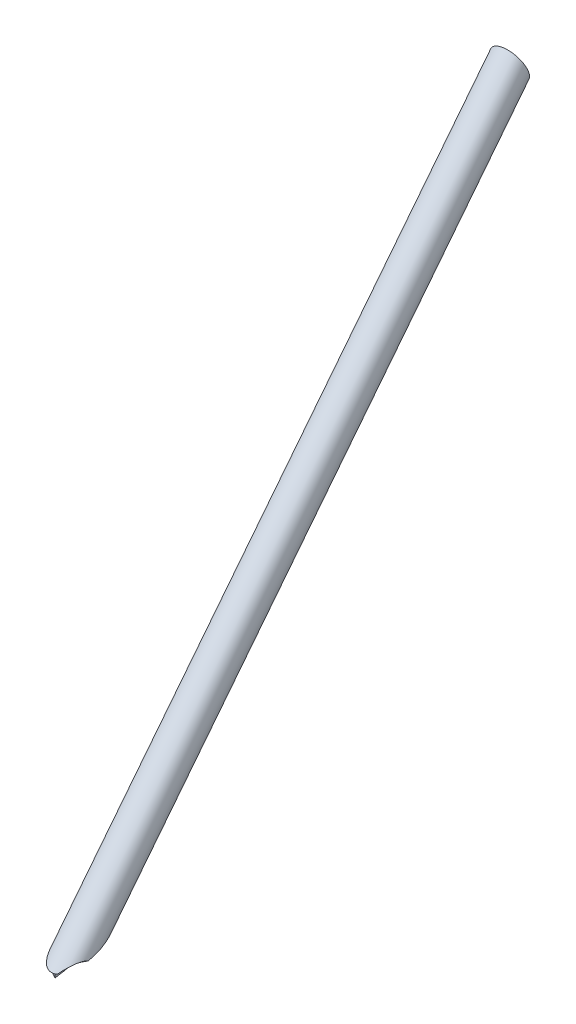
ISO-10303-21;
HEADER;
FILE_DESCRIPTION(('STEP AP214'),'2;1');
FILE_NAME('part.step','',(''),(''),'','','');
FILE_SCHEMA(('AUTOMOTIVE_DESIGN { 1 0 10303 214 1 1 1 1 }'));
ENDSEC;
DATA;
#1=APPLICATION_CONTEXT('core data for automotive mechanical design processes');
#2=APPLICATION_PROTOCOL_DEFINITION('international standard','automotive_design',2000,#1);
#3=PRODUCT_CONTEXT('',#1,'mechanical');
#4=PRODUCT('Part','Part','',(#3));
#5=PRODUCT_RELATED_PRODUCT_CATEGORY('part','',(#4));
#6=PRODUCT_DEFINITION_FORMATION('','',#4);
#7=PRODUCT_DEFINITION_CONTEXT('part definition',#1,'design');
#8=PRODUCT_DEFINITION('design','',#6,#7);
#9=PRODUCT_DEFINITION_SHAPE('','',#8);
#10=(LENGTH_UNIT() NAMED_UNIT(*) SI_UNIT(.MILLI.,.METRE.));
#11=(NAMED_UNIT(*) PLANE_ANGLE_UNIT() SI_UNIT($,.RADIAN.));
#12=(NAMED_UNIT(*) SI_UNIT($,.STERADIAN.) SOLID_ANGLE_UNIT());
#13=UNCERTAINTY_MEASURE_WITH_UNIT(LENGTH_MEASURE(1.E-05),#10,'distance_accuracy_value','');
#14=(GEOMETRIC_REPRESENTATION_CONTEXT(3) GLOBAL_UNCERTAINTY_ASSIGNED_CONTEXT((#13)) GLOBAL_UNIT_ASSIGNED_CONTEXT((#10,
#11,#12)) REPRESENTATION_CONTEXT('',''));
#15=CARTESIAN_POINT('',(0.,0.,0.));
#16=DIRECTION('',(0.,0.,1.));
#17=DIRECTION('',(1.,0.,0.));
#18=AXIS2_PLACEMENT_3D('',#15,#16,#17);
#19=CARTESIAN_POINT('',(79.9999999999999,380.,-601.037933611912));
#20=DIRECTION('',(0.313257210262409,-0.388871019636094,0.866400167535647));
#21=DIRECTION('',(0.,-0.912318699307092,-0.409480879766828));
#22=AXIS2_PLACEMENT_3D('',#19,#20,#21);
#23=CYLINDRICAL_SURFACE('',#22,7.9);
#24=CARTESIAN_POINT('',(222.917953673779,195.377291508024,-208.993378649136));
#25=CARTESIAN_POINT('',(223.012888083571,195.433726930084,-209.119116882952));
#26=CARTESIAN_POINT('',(223.104138431984,195.494269848754,-209.245777184897));
#27=CARTESIAN_POINT('',(223.280105681698,195.622380933648,-209.500115327002));
#28=CARTESIAN_POINT('',(223.364820289401,195.689951546757,-209.627793507182));
#29=CARTESIAN_POINT('',(223.528634818153,195.831254385907,-209.883653952705));
#30=CARTESIAN_POINT('',(223.607725975371,195.904995855745,-210.011836689933));
#31=CARTESIAN_POINT('',(223.76092313275,196.05782740779,-210.268006511559));
#32=CARTESIAN_POINT('',(223.835028227753,196.136918455949,-210.395993556333));
#33=CARTESIAN_POINT('',(224.052309585371,196.382926969586,-210.781500524532));
#34=CARTESIAN_POINT('',(224.188892439851,196.557188455598,-211.038071091826));
#35=CARTESIAN_POINT('',(224.448919782311,196.921959419964,-211.545800007279));
#36=CARTESIAN_POINT('',(224.57237338362,197.112457460483,-211.796962011791));
#37=CARTESIAN_POINT('',(224.776942315472,197.454170356936,-212.224321036627));
#38=CARTESIAN_POINT('',(224.860398831385,197.601869886103,-212.402224269208));
#39=CARTESIAN_POINT('',(225.022962726354,197.904873781393,-212.753515374758));
#40=CARTESIAN_POINT('',(225.102069764739,198.060178741409,-212.926902893478));
#41=CARTESIAN_POINT('',(225.256678731087,198.37843097543,-213.268551379092));
#42=CARTESIAN_POINT('',(225.33217691551,198.541385851937,-213.436806959755));
#43=CARTESIAN_POINT('',(225.479981924259,198.874812249495,-213.767151978885));
#44=CARTESIAN_POINT('',(225.552288904873,199.04528340162,-213.929241719269));
#45=CARTESIAN_POINT('',(225.693490547132,199.392433386815,-214.244967966279));
#46=CARTESIAN_POINT('',(225.762408546937,199.569048964059,-214.398663460934));
#47=CARTESIAN_POINT('',(225.897711302473,199.93003633822,-214.697916975523));
#48=CARTESIAN_POINT('',(225.964095766926,200.114409021873,-214.84347406068));
#49=CARTESIAN_POINT('',(226.09434524523,200.490856212501,-215.124827940735));
#50=CARTESIAN_POINT('',(226.158213993559,200.682918378672,-215.260639469395));
#51=CARTESIAN_POINT('',(226.283530904535,201.075232073557,-215.521007538282));
#52=CARTESIAN_POINT('',(226.344979958602,201.27548052995,-215.645568245636));
#53=CARTESIAN_POINT('',(226.447392881952,201.623434466193,-215.846156403963));
#54=CARTESIAN_POINT('',(226.489000040282,201.768996786018,-215.925578307174));
#55=CARTESIAN_POINT('',(226.570879988234,202.064336964657,-216.076936352935));
#56=CARTESIAN_POINT('',(226.611152863824,202.21411455073,-216.148872978398));
#57=CARTESIAN_POINT('',(226.690286353838,202.51808466004,-216.284297909734));
#58=CARTESIAN_POINT('',(226.729144961922,202.672282939986,-216.347774529356));
#59=CARTESIAN_POINT('',(226.805203274731,202.984791359438,-216.464918322809));
#60=CARTESIAN_POINT('',(226.842402945545,203.143101582897,-216.518585296182));
#61=CARTESIAN_POINT('',(226.915318707242,203.465472644866,-216.615237316068));
#62=CARTESIAN_POINT('',(226.951011861693,203.629579509086,-216.658087577271));
#63=CARTESIAN_POINT('',(227.020095881777,203.961225532968,-216.730573180454));
#64=CARTESIAN_POINT('',(227.053486514953,204.128765036973,-216.7602071898));
#65=CARTESIAN_POINT('',(227.117453561461,204.465988042297,-216.804360539596));
#66=CARTESIAN_POINT('',(227.148036352898,204.635665636074,-216.818914949004));
#67=CARTESIAN_POINT('',(227.205953992873,204.97617559598,-216.831164635051));
#68=CARTESIAN_POINT('',(227.233290498168,205.147007325631,-216.828868549318));
#69=CARTESIAN_POINT('',(227.27660869455,205.437357188732,-216.809230315878));
#70=CARTESIAN_POINT('',(227.293552559481,205.557058073156,-216.796555616039));
#71=CARTESIAN_POINT('',(227.325367727987,205.79532950089,-216.761653431045));
#72=CARTESIAN_POINT('',(227.340239534495,205.913900311961,-216.73942826936));
#73=CARTESIAN_POINT('',(227.36772712879,206.1489753004,-216.685192411289));
#74=CARTESIAN_POINT('',(227.38034435484,206.265480752278,-216.653187988955));
#75=CARTESIAN_POINT('',(227.403191134436,206.495590795566,-216.579366525467));
#76=CARTESIAN_POINT('',(227.413420617519,206.609195301279,-216.5375491948));
#77=CARTESIAN_POINT('',(227.431404675484,206.83273599438,-216.44427565963));
#78=CARTESIAN_POINT('',(227.439156342965,206.942667737856,-216.392808243456));
#79=CARTESIAN_POINT('',(227.45212980558,207.157958152705,-216.280717691105));
#80=CARTESIAN_POINT('',(227.457350720433,207.263315221268,-216.22009137876));
#81=CARTESIAN_POINT('',(227.465277056628,207.4688063395,-216.090339044893));
#82=CARTESIAN_POINT('',(227.467981496067,207.568938336028,-216.021209717486));
#83=CARTESIAN_POINT('',(227.47094093104,207.763484956176,-215.875268256289));
#84=CARTESIAN_POINT('',(227.47119539067,207.857898324429,-215.798454445325));
#85=CARTESIAN_POINT('',(227.469129930289,208.063698052783,-215.617846764081));
#86=CARTESIAN_POINT('',(227.466147125814,208.17338879079,-215.512123181927));
#87=CARTESIAN_POINT('',(227.456780942832,208.383190077019,-215.291735007128));
#88=CARTESIAN_POINT('',(227.450396486557,208.483297577053,-215.177067590581));
#89=CARTESIAN_POINT('',(227.426556723743,208.769705265191,-214.82174132444));
#90=CARTESIAN_POINT('',(227.404417576351,208.941919936901,-214.569913228727));
#91=CARTESIAN_POINT('',(227.356234764604,209.216028962779,-214.107933438384));
#92=CARTESIAN_POINT('',(227.332272238128,209.324979180343,-213.901580818846));
#93=CARTESIAN_POINT('',(227.279095846365,209.524792600736,-213.480815802341));
#94=CARTESIAN_POINT('',(227.249879002337,209.615645482055,-213.266398888436));
#95=CARTESIAN_POINT('',(227.186772988359,209.781289980862,-212.831758977117));
#96=CARTESIAN_POINT('',(227.152875525741,209.85605247573,-212.611526248664));
#97=CARTESIAN_POINT('',(227.080876774895,209.991170373415,-212.167307852279));
#98=CARTESIAN_POINT('',(227.042773938359,210.051520443912,-211.943320828028));
#99=CARTESIAN_POINT('',(226.967170071168,210.153281906896,-211.51831938256));
#100=CARTESIAN_POINT('',(226.930083203064,210.196059843875,-211.317554095141));
#101=CARTESIAN_POINT('',(226.85293914097,210.272416541946,-210.914835503661));
#102=CARTESIAN_POINT('',(226.812881475298,210.305993838234,-210.712882015653));
#103=CARTESIAN_POINT('',(226.68827982986,210.394200770023,-210.105851263459));
#104=CARTESIAN_POINT('',(226.599343421633,210.436258600358,-209.699807799988));
#105=CARTESIAN_POINT('',(226.409137660249,210.492057891408,-208.888068066644));
#106=CARTESIAN_POINT('',(226.307846584326,210.505748692749,-208.482373709036));
#107=CARTESIAN_POINT('',(226.091354588214,210.508417497333,-207.674828554905));
#108=CARTESIAN_POINT('',(225.976160610319,210.497407786651,-207.27297594734));
#109=CARTESIAN_POINT('',(225.763795783198,210.459623860328,-206.589380363559));
#110=CARTESIAN_POINT('',(225.67083158185,210.438230593355,-206.306016005625));
#111=CARTESIAN_POINT('',(225.474155076724,210.384826129073,-205.743942110612));
#112=CARTESIAN_POINT('',(225.370440492558,210.352812675813,-205.465233575753));
#113=CARTESIAN_POINT('',(225.149939011165,210.278697870624,-204.915178227719));
#114=CARTESIAN_POINT('',(225.033185126912,210.236621700209,-204.643814891119));
#115=CARTESIAN_POINT('',(224.782856186306,210.142507957935,-204.110762193817));
#116=CARTESIAN_POINT('',(224.64929217133,210.090476913159,-203.849066627678));
#117=CARTESIAN_POINT('',(224.424528459865,210.001528868784,-203.452660568412));
#118=CARTESIAN_POINT('',(224.340714883951,209.968103612592,-203.312972759542));
#119=CARTESIAN_POINT('',(224.16550257525,209.898009301119,-203.039301887405));
#120=CARTESIAN_POINT('',(224.07410623106,209.861341267085,-202.905317047656));
#121=CARTESIAN_POINT('',(223.882978374415,209.784689112119,-202.644700624613));
#122=CARTESIAN_POINT('',(223.783259196538,209.744709899061,-202.518058615116));
#123=CARTESIAN_POINT('',(223.574674929642,209.661237798938,-202.273755976076));
#124=CARTESIAN_POINT('',(223.465811873719,209.617745693031,-202.156093361056));
#125=CARTESIAN_POINT('',(223.257198986513,209.534480814693,-201.950119399441));
#126=CARTESIAN_POINT('',(223.158864877578,209.495260820413,-201.860152986442));
#127=CARTESIAN_POINT('',(222.955755076029,209.41413902135,-201.689159176252));
#128=CARTESIAN_POINT('',(222.850980978708,209.372237880628,-201.60812957905));
#129=CARTESIAN_POINT('',(222.63558099683,209.28567993122,-201.456108997409));
#130=CARTESIAN_POINT('',(222.524959774306,209.241025313342,-201.385110176307));
#131=CARTESIAN_POINT('',(222.298673344678,209.148832520759,-201.253819301503));
#132=CARTESIAN_POINT('',(222.183008023939,209.10129428108,-201.193527489166));
#133=CARTESIAN_POINT('',(221.947946209617,209.003301821729,-201.08404474988));
#134=CARTESIAN_POINT('',(221.828554782513,208.952851488607,-201.034839438096));
#135=CARTESIAN_POINT('',(221.587170362088,208.848873809021,-200.947303863317));
#136=CARTESIAN_POINT('',(221.465177335506,208.795346423199,-200.908973739456));
#137=CARTESIAN_POINT('',(221.219635699899,208.6850060593,-200.84263902345));
#138=CARTESIAN_POINT('',(221.09608483156,208.628187738916,-200.814651797489));
#139=CARTESIAN_POINT('',(220.848740169297,208.511212165082,-200.768343470395));
#140=CARTESIAN_POINT('',(220.72494631865,208.451054011646,-200.750024988817));
#141=CARTESIAN_POINT('',(220.427388225815,208.301836143795,-200.716481000202));
#142=CARTESIAN_POINT('',(220.253987472562,208.211055871608,-200.705617554726));
#143=CARTESIAN_POINT('',(219.910873942063,208.022246686899,-200.698951509076));
#144=CARTESIAN_POINT('',(219.74116264417,207.924214933684,-200.703154842086));
#145=CARTESIAN_POINT('',(219.406967398977,207.720526131168,-200.724369254204));
#146=CARTESIAN_POINT('',(219.242489569331,207.614860598322,-200.741394787105));
#147=CARTESIAN_POINT('',(218.920338997022,207.395819981203,-200.786311135998));
#148=CARTESIAN_POINT('',(218.762665566206,207.282445679547,-200.814200850383));
#149=CARTESIAN_POINT('',(218.451143834345,207.044747848438,-200.8800687085));
#150=CARTESIAN_POINT('',(218.297509602692,206.920212984307,-200.918296003976));
#151=CARTESIAN_POINT('',(217.99969711304,206.662911240161,-201.002982012353));
#152=CARTESIAN_POINT('',(217.855518972799,206.530144257672,-201.049440827734));
#153=CARTESIAN_POINT('',(217.577684913564,206.256559124255,-201.149316624966));
#154=CARTESIAN_POINT('',(217.444025502087,206.115743672657,-201.20273128153));
#155=CARTESIAN_POINT('',(217.188143780322,205.82629222245,-201.315446203212));
#156=CARTESIAN_POINT('',(217.065921683216,205.67765607815,-201.374746577991));
#157=CARTESIAN_POINT('',(216.818449707006,205.352758974325,-201.506466109889));
#158=CARTESIAN_POINT('',(216.694943875566,205.175447006607,-201.579582460562));
#159=CARTESIAN_POINT('',(216.465036896667,204.812085638978,-201.730891239238));
#160=CARTESIAN_POINT('',(216.358637262913,204.626035467714,-201.809084115598));
#161=CARTESIAN_POINT('',(216.164085426222,204.246214889201,-201.969410091894));
#162=CARTESIAN_POINT('',(216.075934819797,204.052443808256,-202.051543535796));
#163=CARTESIAN_POINT('',(215.918889566562,203.658450119279,-202.218683884008));
#164=CARTESIAN_POINT('',(215.849993628238,203.458227944962,-202.303690595164));
#165=CARTESIAN_POINT('',(215.734867726172,203.061803652908,-202.471769907068));
#166=CARTESIAN_POINT('',(215.68776480266,202.865819763355,-202.554759983786));
#167=CARTESIAN_POINT('',(215.612343670876,202.470666681871,-202.72168872225));
#168=CARTESIAN_POINT('',(215.584025008877,202.271497566998,-202.805627361036));
#169=CARTESIAN_POINT('',(215.546447957857,201.871514583642,-202.973728691702));
#170=CARTESIAN_POINT('',(215.537185499508,201.670701075508,-203.057891331904));
#171=CARTESIAN_POINT('',(215.537750207621,201.268949260368,-203.225844852274));
#172=CARTESIAN_POINT('',(215.547577042792,201.068010955589,-203.309635738869));
#173=CARTESIAN_POINT('',(215.585424907072,200.674922537729,-203.473292469335));
#174=CARTESIAN_POINT('',(215.612767598652,200.482719716404,-203.553189812385));
#175=CARTESIAN_POINT('',(215.684636938621,200.101082578048,-203.711833940497));
#176=CARTESIAN_POINT('',(215.729163062789,199.911648176743,-203.790580760581));
#177=CARTESIAN_POINT('',(215.834869093322,199.536951800123,-203.946699267579));
#178=CARTESIAN_POINT('',(215.896046194203,199.351689127611,-204.02407118381));
#179=CARTESIAN_POINT('',(216.034397675555,198.986627479458,-204.17738254473));
#180=CARTESIAN_POINT('',(216.111572507493,198.806828658174,-204.253321948926));
#181=CARTESIAN_POINT('',(216.283407311308,198.449273056606,-204.405855833697));
#182=CARTESIAN_POINT('',(216.378478408997,198.271698357487,-204.482413848804));
#183=CARTESIAN_POINT('',(216.583734695358,197.924998694342,-204.634385497369));
#184=CARTESIAN_POINT('',(216.693920250783,197.755873935489,-204.709799103008));
#185=CARTESIAN_POINT('',(216.928573516772,197.42714427999,-204.860097143598));
#186=CARTESIAN_POINT('',(217.053063010664,197.267554481128,-204.934980582035));
#187=CARTESIAN_POINT('',(217.315093507492,196.959532309164,-205.084858885813));
#188=CARTESIAN_POINT('',(217.452634619372,196.811100029214,-205.159853752079));
#189=CARTESIAN_POINT('',(217.74781967697,196.518671882273,-205.315349883156));
#190=CARTESIAN_POINT('',(217.906164023397,196.375418041153,-205.395920366552));
#191=CARTESIAN_POINT('',(218.234594571859,196.104845444808,-205.560075865198));
#192=CARTESIAN_POINT('',(218.404683856961,195.97753089854,-205.643661669203));
#193=CARTESIAN_POINT('',(218.754235675554,195.741370653123,-205.815808955141));
#194=CARTESIAN_POINT('',(218.933675075028,195.632481961031,-205.904358194198));
#195=CARTESIAN_POINT('',(219.299747525742,195.435451907522,-206.089241304079));
#196=CARTESIAN_POINT('',(219.486375089876,195.347295071874,-206.185569296241));
#197=CARTESIAN_POINT('',(219.793251431257,195.222976637926,-206.351084656116));
#198=CARTESIAN_POINT('',(219.912373415155,195.179671075599,-206.417042118076));
#199=CARTESIAN_POINT('',(220.151005188231,195.103057228875,-206.553846790806));
#200=CARTESIAN_POINT('',(220.270514828831,195.06974548768,-206.624692300378));
#201=CARTESIAN_POINT('',(220.50846863154,195.013756730285,-206.771677314262));
#202=CARTESIAN_POINT('',(220.626914361182,194.991060062307,-206.847806733818));
#203=CARTESIAN_POINT('',(220.861596385622,194.956587119082,-207.005754442102));
#204=CARTESIAN_POINT('',(220.977832726073,194.944810617953,-207.087572613119));
#205=CARTESIAN_POINT('',(221.207162743245,194.932209315987,-207.257157945612));
#206=CARTESIAN_POINT('',(221.320243370483,194.931424729255,-207.344945771363));
#207=CARTESIAN_POINT('',(221.541642393554,194.940579543406,-207.525808650194));
#208=CARTESIAN_POINT('',(221.649960489993,194.950519617486,-207.618884034832));
#209=CARTESIAN_POINT('',(221.86109634729,194.98045261893,-207.809740108287));
#210=CARTESIAN_POINT('',(221.963908207163,195.000456101711,-207.90752563995));
#211=CARTESIAN_POINT('',(222.163459474489,195.049580788275,-208.106862234736));
#212=CARTESIAN_POINT('',(222.260199668273,195.078700808456,-208.208412807535));
#213=CARTESIAN_POINT('',(222.454861603191,195.147601918441,-208.422453077104));
#214=CARTESIAN_POINT('',(222.552289740284,195.188036169818,-208.535179176933));
#215=CARTESIAN_POINT('',(222.740160343575,195.276929151579,-208.762806038352));
#216=CARTESIAN_POINT('',(222.830616031523,195.325372117433,-208.877702142515));
#217=CARTESIAN_POINT('',(222.917953673779,195.377291508024,-208.993378649136));
#218=B_SPLINE_CURVE_WITH_KNOTS('',3,(#24,#25,#26,#27,#28,#29,#30,#31,#32,#33,#34,#35,#36,#37,
#38,#39,#40,#41,#42,#43,#44,#45,#46,#47,#48,#49,#50,#51,#52,#53,#54,#55,#56,#57,#58,#59,#60,#61,
#62,#63,#64,#65,#66,#67,#68,#69,#70,#71,#72,#73,#74,#75,#76,#77,#78,#79,#80,#81,#82,#83,#84,#85,
#86,#87,#88,#89,#90,#91,#92,#93,#94,#95,#96,#97,#98,#99,#100,#101,#102,#103,#104,#105,#106,#107,
#108,#109,#110,#111,#112,#113,#114,#115,#116,#117,#118,#119,#120,#121,#122,#123,#124,#125,#126,
#127,#128,#129,#130,#131,#132,#133,#134,#135,#136,#137,#138,#139,#140,#141,#142,#143,#144,#145,
#146,#147,#148,#149,#150,#151,#152,#153,#154,#155,#156,#157,#158,#159,#160,#161,#162,#163,#164,
#165,#166,#167,#168,#169,#170,#171,#172,#173,#174,#175,#176,#177,#178,#179,#180,#181,#182,#183,
#184,#185,#186,#187,#188,#189,#190,#191,#192,#193,#194,#195,#196,#197,#198,#199,#200,#201,#202,
#203,#204,#205,#206,#207,#208,#209,#210,#211,#212,#213,#214,#215,#216,#217),.UNSPECIFIED.,.T.,
.F.,(4,2,2,2,2,2,2,2,2,2,2,2,2,2,2,2,2,2,2,2,2,2,2,2,2,2,2,2,2,2,2,2,2,2,2,2,2,2,2,2,2,2,2,2,2,
2,2,2,2,2,2,2,2,2,2,2,2,2,2,2,2,2,2,2,2,2,2,2,2,2,2,2,2,2,2,2,2,2,2,2,2,2,2,2,2,2,2,2,2,2,2,2,2,
2,2,2,4),(0.,0.501979882139892,1.00413513115695,1.50705654486517,2.0100690127652,
3.02582965679052,4.04088057087978,4.77816509051007,5.51550727539348,6.25359842143096,
6.99165337942033,7.72358343543746,8.4555973890299,9.18648025840635,9.91709130059194,
10.4297824288631,10.9424404602356,11.4557994712606,11.9691689714871,12.4886505993399,
13.0081845962283,13.5265076397799,14.0445650075223,14.4088782944886,14.7731030001686,
15.1370945201267,15.5010967803834,15.8655245963429,16.2300790817395,16.5947757529523,
16.9595521953225,17.4159798550026,17.8725522138062,18.7863795763022,19.4892533311771,
20.1925268175673,20.8970626764465,21.6018587975711,22.2273983694162,22.8530374734778,
24.1049509723517,25.3590982857575,26.6126219226087,27.5092439394125,28.406056539774,
29.3006479655711,30.1946548349905,30.6933035171723,31.1917957155067,31.6895618299294,
32.1872175599735,32.6035896846046,33.0198590793759,33.4358014387767,33.851753173463,
34.2671620585495,34.6825762580349,35.0986848209851,35.5149060625068,36.1021133349875,
36.6895518706612,37.2776535880259,37.8656956884923,38.4694161526879,39.0731441335761,
39.6766708083442,40.2802087301078,40.9637044712599,41.6472606608149,42.3308766258936,
43.0144467262128,43.6675667339704,44.3206709652983,44.9736357159827,45.6265891346727,
46.2556697851236,46.8847312455691,47.5136867824822,48.142660071415,48.7883935293109,
49.4341426587159,50.0808885633709,50.7276398670169,51.4114642876654,52.0954689009143,
52.7778548394482,53.4597298177947,53.8880091039286,54.3161400797531,54.7434752845416,
55.1708016497543,55.5996909891752,56.0286072519844,56.4579743420713,56.8872857104394,
57.3499967453642,57.8118075836265),.UNSPECIFIED.);
#219=CARTESIAN_POINT('',(227.0734472286,210.,-212.126605746777));
#220=VERTEX_POINT('',#219);
#221=CARTESIAN_POINT('',(224.420881433489,210.,-203.449159749219));
#222=VERTEX_POINT('',#221);
#223=EDGE_CURVE('E105',#220,#222,#218,.T.);
#224=ORIENTED_EDGE('',*,*,#223,.T.);
#225=CARTESIAN_POINT('',(216.944444444444,210.,-222.279885200662));
#226=DIRECTION('',(0.,-1.,0.));
#227=DIRECTION('',(0.340019385805579,0.,0.940418426699731));
#228=AXIS2_PLACEMENT_3D('',#225,#226,#227);
#229=ELLIPSE('',#228,20.3152191885958,7.9);
#230=CARTESIAN_POINT('',(214.223926995827,210.,-210.));
#231=VERTEX_POINT('',#230);
#232=EDGE_CURVE('E94',#222,#231,#229,.T.);
#233=ORIENTED_EDGE('',*,*,#232,.T.);
#234=CARTESIAN_POINT('',(221.38438192881,204.488353467684,-210.));
#235=DIRECTION('',(0.,0.,1.));
#236=DIRECTION('',(0.627329537872645,-0.778753909083283,0.));
#237=AXIS2_PLACEMENT_3D('',#234,#235,#236);
#238=ELLIPSE('',#237,9.11818844919022,7.9);
#239=CARTESIAN_POINT('',(215.,199.831593159286,-210.));
#240=VERTEX_POINT('',#239);
#241=EDGE_CURVE('E104',#231,#240,#238,.T.);
#242=ORIENTED_EDGE('',*,*,#241,.T.);
#243=CARTESIAN_POINT('',(215.,212.413793103448,-227.657788524959));
#244=DIRECTION('',(1.,0.,0.));
#245=DIRECTION('',(0.,-0.409480879766828,0.912318699307092));
#246=AXIS2_PLACEMENT_3D('',#243,#244,#245);
#247=ELLIPSE('',#246,25.2188927858431,7.9);
#248=CARTESIAN_POINT('',(215.,210.,-239.923532285982));
#249=VERTEX_POINT('',#248);
#250=EDGE_CURVE('E85',#240,#249,#247,.T.);
#251=ORIENTED_EDGE('',*,*,#250,.T.);
#252=EDGE_CURVE('E56',#249,#220,#229,.T.);
#253=ORIENTED_EDGE('',*,*,#252,.T.);
#254=EDGE_LOOP('',(#224,#233,#242,#251,#253));
#255=FACE_BOUND('',#254,.T.);
#256=CARTESIAN_POINT('',(80.,380.,-601.037933611912));
#257=DIRECTION('',(-0.0966021654991003,0.31145037677638,-0.945339454601751));
#258=DIRECTION('',(0.909209641489906,-0.358833563956318,-0.211131004829238));
#259=AXIS2_PLACEMENT_3D('',#256,#257,#258);
#260=ELLIPSE('',#259,8.14082504262806,7.9);
#261=CARTESIAN_POINT('',(87.4017166184399,377.078798736409,-602.756714183301));
#262=VERTEX_POINT('',#261);
#263=EDGE_CURVE('E43',#262,#262,#260,.T.);
#264=ORIENTED_EDGE('',*,*,#263,.T.);
#265=EDGE_LOOP('',(#264));
#266=FACE_BOUND('',#265,.T.);
#267=ADVANCED_FACE('F39',(#255,#266),#23,.F.);
#268=CARTESIAN_POINT('',(79.9999999999999,380.,-601.037933611912));
#269=DIRECTION('',(0.313257210262409,-0.388871019636094,0.866400167535647));
#270=DIRECTION('',(0.,-0.912318699307092,-0.409480879766828));
#271=AXIS2_PLACEMENT_3D('',#268,#269,#270);
#272=CYLINDRICAL_SURFACE('',#271,9.5);
#273=CARTESIAN_POINT('',(216.944444444444,210.,-222.279885200662));
#274=DIRECTION('',(0.,-1.,0.));
#275=DIRECTION('',(0.340019385805579,0.,0.940418426699731));
#276=AXIS2_PLACEMENT_3D('',#273,#274,#275);
#277=ELLIPSE('',#276,24.4296939609696,9.5);
#278=CARTESIAN_POINT('',(226.408415127519,210.,-199.974629586691));
#279=VERTEX_POINT('',#278);
#280=CARTESIAN_POINT('',(212.152625115666,210.,-210.));
#281=VERTEX_POINT('',#280);
#282=EDGE_CURVE('E153',#279,#281,#277,.T.);
#283=ORIENTED_EDGE('',*,*,#282,.F.);
#284=CARTESIAN_POINT('',(225.,200.,-200.));
#285=DIRECTION('',(0.979997411230481,-0.1383871597552,0.143017719169493));
#286=DIRECTION('',(-0.18494238420669,-0.367901037751926,0.911287627999525));
#287=AXIS2_PLACEMENT_3D('',#284,#285,#286);
#288=ELLIPSE('',#287,19.5990817258114,9.5);
#289=CARTESIAN_POINT('',(228.616604705313,210.,-215.105762164605));
#290=VERTEX_POINT('',#289);
#291=EDGE_CURVE('E112',#290,#279,#288,.T.);
#292=ORIENTED_EDGE('',*,*,#291,.F.);
#293=CARTESIAN_POINT('',(215.,210.,-243.177807236862));
#294=VERTEX_POINT('',#293);
#295=EDGE_CURVE('E48',#294,#290,#277,.T.);
#296=ORIENTED_EDGE('',*,*,#295,.F.);
#297=CARTESIAN_POINT('',(215.,212.413793103448,-227.657788524959));
#298=DIRECTION('',(1.,0.,0.));
#299=DIRECTION('',(0.,-0.409480879766828,0.912318699307092));
#300=AXIS2_PLACEMENT_3D('',#297,#298,#299);
#301=ELLIPSE('',#300,30.3265166412037,9.5);
#302=CARTESIAN_POINT('',(215.,197.413463504428,-210.));
#303=VERTEX_POINT('',#302);
#304=EDGE_CURVE('E81',#303,#294,#301,.T.);
#305=ORIENTED_EDGE('',*,*,#304,.F.);
#306=CARTESIAN_POINT('',(221.38438192881,204.488353467684,-210.));
#307=DIRECTION('',(0.,0.,1.));
#308=DIRECTION('',(0.627329537872645,-0.778753909083283,0.));
#309=AXIS2_PLACEMENT_3D('',#306,#307,#308);
#310=ELLIPSE('',#309,10.9649101604186,9.5);
#311=EDGE_CURVE('E169',#281,#303,#310,.T.);
#312=ORIENTED_EDGE('',*,*,#311,.F.);
#313=EDGE_LOOP('',(#283,#292,#296,#305,#312));
#314=FACE_BOUND('',#313,.T.);
#315=CARTESIAN_POINT('',(80.,380.,-601.037933611912));
#316=DIRECTION('',(-0.0966021654991003,0.31145037677638,-0.945339454601751));
#317=DIRECTION('',(0.909209641489906,-0.358833563956318,-0.211131004829238));
#318=AXIS2_PLACEMENT_3D('',#315,#316,#317);
#319=ELLIPSE('',#318,9.78959973480588,9.5);
#320=CARTESIAN_POINT('',(88.9007984652125,376.487163037454,-603.104821640798));
#321=VERTEX_POINT('',#320);
#322=EDGE_CURVE('E11',#321,#321,#319,.T.);
#323=ORIENTED_EDGE('',*,*,#322,.F.);
#324=EDGE_LOOP('',(#323));
#325=FACE_BOUND('',#324,.T.);
#326=ADVANCED_FACE('F130',(#314,#325),#272,.T.);
#327=CARTESIAN_POINT('',(50.0000000000001,130.,0.));
#328=DIRECTION('',(0.636784790371593,0.254713916148637,-0.727754046138963));
#329=DIRECTION('',(-0.752576694706878,0.,-0.658504607868518));
#330=AXIS2_PLACEMENT_3D('',#327,#328,#329);
#331=CYLINDRICAL_SURFACE('',#330,9.5);
#332=ORIENTED_EDGE('',*,*,#291,.T.);
#333=CARTESIAN_POINT('',(250.,210.,-228.571428571428));
#334=DIRECTION('',(0.,-1.,0.));
#335=DIRECTION('',(0.658504607868518,0.,-0.752576694706878));
#336=AXIS2_PLACEMENT_3D('',#333,#334,#335);
#337=ELLIPSE('',#336,37.2967450842235,9.5);
#338=EDGE_CURVE('E97',#279,#222,#337,.T.);
#339=ORIENTED_EDGE('',*,*,#338,.T.);
#340=ORIENTED_EDGE('',*,*,#223,.F.);
#341=EDGE_CURVE('E62',#220,#290,#337,.T.);
#342=ORIENTED_EDGE('',*,*,#341,.T.);
#343=EDGE_LOOP('',(#332,#339,#340,#342));
#344=FACE_BOUND('',#343,.T.);
#345=ADVANCED_FACE('F110',(#344),#331,.F.);
#346=CARTESIAN_POINT('',(-225.,190.,-210.));
#347=DIRECTION('',(0.,0.,1.));
#348=DIRECTION('',(1.,0.,0.));
#349=AXIS2_PLACEMENT_3D('',#346,#347,#348);
#350=PLANE('',#349);
#351=DIRECTION('',(1.,0.,0.));
#352=VECTOR('',#351,1.);
#353=CARTESIAN_POINT('',(-225.,210.,-210.));
#354=LINE('',#353,#352);
#355=EDGE_CURVE('E100',#281,#231,#354,.T.);
#356=ORIENTED_EDGE('',*,*,#355,.F.);
#357=ORIENTED_EDGE('',*,*,#311,.T.);
#358=DIRECTION('',(0.,1.,0.));
#359=VECTOR('',#358,1.);
#360=CARTESIAN_POINT('',(215.,190.,-210.));
#361=LINE('',#360,#359);
#362=EDGE_CURVE('E168',#303,#240,#361,.T.);
#363=ORIENTED_EDGE('',*,*,#362,.T.);
#364=ORIENTED_EDGE('',*,*,#241,.F.);
#365=EDGE_LOOP('',(#356,#357,#363,#364));
#366=FACE_BOUND('',#365,.T.);
#367=ADVANCED_FACE('F129',(#366),#350,.T.);
#368=CARTESIAN_POINT('',(215.,190.,-200.));
#369=DIRECTION('',(1.,0.,0.));
#370=DIRECTION('',(0.,0.,-1.));
#371=AXIS2_PLACEMENT_3D('',#368,#369,#370);
#372=PLANE('',#371);
#373=ORIENTED_EDGE('',*,*,#362,.F.);
#374=ORIENTED_EDGE('',*,*,#304,.T.);
#375=DIRECTION('',(0.,0.,-1.));
#376=VECTOR('',#375,1.);
#377=CARTESIAN_POINT('',(215.,210.,-200.));
#378=LINE('',#377,#376);
#379=EDGE_CURVE('E166',#249,#294,#378,.T.);
#380=ORIENTED_EDGE('',*,*,#379,.F.);
#381=ORIENTED_EDGE('',*,*,#250,.F.);
#382=EDGE_LOOP('',(#373,#374,#380,#381));
#383=FACE_BOUND('',#382,.T.);
#384=ADVANCED_FACE('F133',(#383),#372,.T.);
#385=CARTESIAN_POINT('',(-225.,210.,-190.));
#386=DIRECTION('',(0.,-1.,0.));
#387=DIRECTION('',(0.,0.,-1.));
#388=AXIS2_PLACEMENT_3D('',#385,#386,#387);
#389=PLANE('',#388);
#390=ORIENTED_EDGE('',*,*,#338,.F.);
#391=ORIENTED_EDGE('',*,*,#282,.T.);
#392=ORIENTED_EDGE('',*,*,#355,.T.);
#393=ORIENTED_EDGE('',*,*,#232,.F.);
#394=EDGE_LOOP('',(#390,#391,#392,#393));
#395=FACE_BOUND('',#394,.T.);
#396=ADVANCED_FACE('F96',(#395),#389,.T.);
#397=ORIENTED_EDGE('',*,*,#379,.T.);
#398=ORIENTED_EDGE('',*,*,#295,.T.);
#399=ORIENTED_EDGE('',*,*,#341,.F.);
#400=ORIENTED_EDGE('',*,*,#252,.F.);
#401=EDGE_LOOP('',(#397,#398,#399,#400));
#402=FACE_BOUND('',#401,.T.);
#403=ADVANCED_FACE('F135',(#402),#389,.T.);
#404=CARTESIAN_POINT('',(80.,380.,-601.037933611912));
#405=DIRECTION('',(-0.0966021654991003,0.31145037677638,-0.945339454601751));
#406=DIRECTION('',(0.,0.949781512459289,0.312913851707695));
#407=AXIS2_PLACEMENT_3D('',#404,#405,#406);
#408=PLANE('',#407);
#409=ORIENTED_EDGE('',*,*,#263,.F.);
#410=EDGE_LOOP('',(#409));
#411=FACE_BOUND('',#410,.T.);
#412=ORIENTED_EDGE('',*,*,#322,.T.);
#413=EDGE_LOOP('',(#412));
#414=FACE_BOUND('',#413,.T.);
#415=ADVANCED_FACE('F41',(#411,#414),#408,.T.);
#416=CLOSED_SHELL('',(#267,#326,#345,#367,#384,#396,#403,#415));
#417=MANIFOLD_SOLID_BREP('B2',#416);
#418=ADVANCED_BREP_SHAPE_REPRESENTATION('',(#18,#417),#14);
#419=SHAPE_DEFINITION_REPRESENTATION(#9,#418);
ENDSEC;
END-ISO-10303-21;
